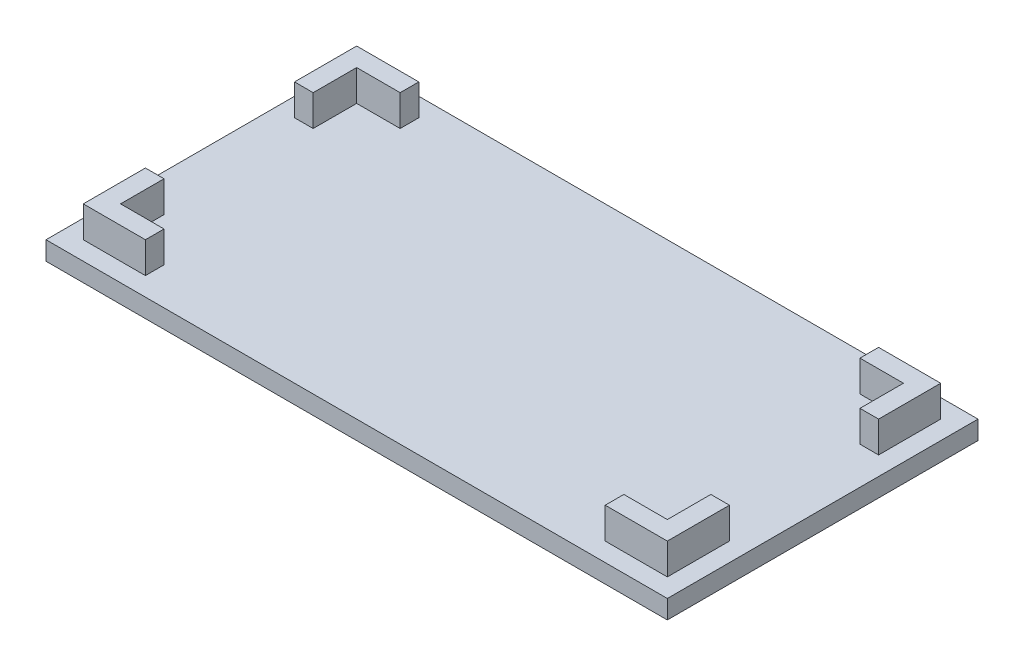
ISO-10303-21;
HEADER;
FILE_DESCRIPTION(('STEP AP214'),'2;1');
FILE_NAME('part.step','',(''),(''),'','','');
FILE_SCHEMA(('AUTOMOTIVE_DESIGN { 1 0 10303 214 1 1 1 1 }'));
ENDSEC;
DATA;
#1=APPLICATION_CONTEXT('core data for automotive mechanical design processes');
#2=APPLICATION_PROTOCOL_DEFINITION('international standard','automotive_design',2000,#1);
#3=PRODUCT_CONTEXT('',#1,'mechanical');
#4=PRODUCT('Part','Part','',(#3));
#5=PRODUCT_RELATED_PRODUCT_CATEGORY('part','',(#4));
#6=PRODUCT_DEFINITION_FORMATION('','',#4);
#7=PRODUCT_DEFINITION_CONTEXT('part definition',#1,'design');
#8=PRODUCT_DEFINITION('design','',#6,#7);
#9=PRODUCT_DEFINITION_SHAPE('','',#8);
#10=(LENGTH_UNIT() NAMED_UNIT(*) SI_UNIT(.MILLI.,.METRE.));
#11=(NAMED_UNIT(*) PLANE_ANGLE_UNIT() SI_UNIT($,.RADIAN.));
#12=(NAMED_UNIT(*) SI_UNIT($,.STERADIAN.) SOLID_ANGLE_UNIT());
#13=UNCERTAINTY_MEASURE_WITH_UNIT(LENGTH_MEASURE(1.E-05),#10,'distance_accuracy_value','');
#14=(GEOMETRIC_REPRESENTATION_CONTEXT(3) GLOBAL_UNCERTAINTY_ASSIGNED_CONTEXT((#13)) GLOBAL_UNIT_ASSIGNED_CONTEXT((#10,
#11,#12)) REPRESENTATION_CONTEXT('',''));
#15=CARTESIAN_POINT('',(0.,0.,0.));
#16=DIRECTION('',(0.,0.,1.));
#17=DIRECTION('',(1.,0.,0.));
#18=AXIS2_PLACEMENT_3D('',#15,#16,#17);
#19=CARTESIAN_POINT('',(0.,3.,0.));
#20=DIRECTION('',(0.,-1.,0.));
#21=DIRECTION('',(0.,0.,-1.));
#22=AXIS2_PLACEMENT_3D('',#19,#20,#21);
#23=PLANE('',#22);
#24=DIRECTION('',(0.,0.,1.));
#25=VECTOR('',#24,1.);
#26=CARTESIAN_POINT('',(87.,3.,-44.));
#27=LINE('',#26,#25);
#28=CARTESIAN_POINT('',(87.,3.,-47.));
#29=VERTEX_POINT('',#28);
#30=CARTESIAN_POINT('',(87.,3.,-44.));
#31=VERTEX_POINT('',#30);
#32=EDGE_CURVE('E339',#29,#31,#27,.T.);
#33=ORIENTED_EDGE('',*,*,#32,.F.);
#34=DIRECTION('',(-1.,0.,0.));
#35=VECTOR('',#34,1.);
#36=CARTESIAN_POINT('',(87.,3.,-47.));
#37=LINE('',#36,#35);
#38=CARTESIAN_POINT('',(97.,3.,-47.));
#39=VERTEX_POINT('',#38);
#40=EDGE_CURVE('E318',#39,#29,#37,.T.);
#41=ORIENTED_EDGE('',*,*,#40,.F.);
#42=DIRECTION('',(0.,0.,-1.));
#43=VECTOR('',#42,1.);
#44=CARTESIAN_POINT('',(97.,3.,-47.));
#45=LINE('',#44,#43);
#46=CARTESIAN_POINT('',(97.,3.,-37.));
#47=VERTEX_POINT('',#46);
#48=EDGE_CURVE('E322',#47,#39,#45,.T.);
#49=ORIENTED_EDGE('',*,*,#48,.F.);
#50=DIRECTION('',(1.,0.,0.));
#51=VECTOR('',#50,1.);
#52=CARTESIAN_POINT('',(97.,3.,-37.));
#53=LINE('',#52,#51);
#54=CARTESIAN_POINT('',(94.,3.,-37.));
#55=VERTEX_POINT('',#54);
#56=EDGE_CURVE('E327',#55,#47,#53,.T.);
#57=ORIENTED_EDGE('',*,*,#56,.F.);
#58=DIRECTION('',(0.,0.,1.));
#59=VECTOR('',#58,1.);
#60=CARTESIAN_POINT('',(94.,3.,-37.));
#61=LINE('',#60,#59);
#62=CARTESIAN_POINT('',(94.,3.,-44.));
#63=VERTEX_POINT('',#62);
#64=EDGE_CURVE('E331',#63,#55,#61,.T.);
#65=ORIENTED_EDGE('',*,*,#64,.F.);
#66=DIRECTION('',(1.,0.,0.));
#67=VECTOR('',#66,1.);
#68=CARTESIAN_POINT('',(94.,3.,-44.));
#69=LINE('',#68,#67);
#70=EDGE_CURVE('E335',#31,#63,#69,.T.);
#71=ORIENTED_EDGE('',*,*,#70,.F.);
#72=EDGE_LOOP('',(#33,#41,#49,#57,#65,#71));
#73=FACE_BOUND('',#72,.T.);
#74=DIRECTION('',(1.,0.,0.));
#75=VECTOR('',#74,1.);
#76=CARTESIAN_POINT('',(5.99999999999997,3.,-37.));
#77=LINE('',#76,#75);
#78=CARTESIAN_POINT('',(2.99999999999997,3.,-37.));
#79=VERTEX_POINT('',#78);
#80=CARTESIAN_POINT('',(5.99999999999997,3.,-37.));
#81=VERTEX_POINT('',#80);
#82=EDGE_CURVE('E239',#79,#81,#77,.T.);
#83=ORIENTED_EDGE('',*,*,#82,.F.);
#84=DIRECTION('',(0.,0.,1.));
#85=VECTOR('',#84,1.);
#86=CARTESIAN_POINT('',(2.99999999999997,3.,-37.));
#87=LINE('',#86,#85);
#88=CARTESIAN_POINT('',(2.99999999999997,3.,-47.));
#89=VERTEX_POINT('',#88);
#90=EDGE_CURVE('E427',#89,#79,#87,.T.);
#91=ORIENTED_EDGE('',*,*,#90,.F.);
#92=DIRECTION('',(-1.,0.,0.));
#93=VECTOR('',#92,1.);
#94=CARTESIAN_POINT('',(2.99999999999997,3.,-47.));
#95=LINE('',#94,#93);
#96=CARTESIAN_POINT('',(13.,3.,-47.));
#97=VERTEX_POINT('',#96);
#98=EDGE_CURVE('E458',#97,#89,#95,.T.);
#99=ORIENTED_EDGE('',*,*,#98,.F.);
#100=DIRECTION('',(0.,0.,-1.));
#101=VECTOR('',#100,1.);
#102=CARTESIAN_POINT('',(13.,3.,-47.));
#103=LINE('',#102,#101);
#104=CARTESIAN_POINT('',(13.,3.,-44.));
#105=VERTEX_POINT('',#104);
#106=EDGE_CURVE('E454',#105,#97,#103,.T.);
#107=ORIENTED_EDGE('',*,*,#106,.F.);
#108=DIRECTION('',(1.,0.,0.));
#109=VECTOR('',#108,1.);
#110=CARTESIAN_POINT('',(13.,3.,-44.));
#111=LINE('',#110,#109);
#112=CARTESIAN_POINT('',(5.99999999999997,3.,-44.));
#113=VERTEX_POINT('',#112);
#114=EDGE_CURVE('E450',#113,#105,#111,.T.);
#115=ORIENTED_EDGE('',*,*,#114,.F.);
#116=DIRECTION('',(0.,0.,-1.));
#117=VECTOR('',#116,1.);
#118=CARTESIAN_POINT('',(5.99999999999997,3.,-44.));
#119=LINE('',#118,#117);
#120=EDGE_CURVE('E446',#81,#113,#119,.T.);
#121=ORIENTED_EDGE('',*,*,#120,.F.);
#122=EDGE_LOOP('',(#83,#91,#99,#107,#115,#121));
#123=FACE_BOUND('',#122,.T.);
#124=DIRECTION('',(0.,0.,1.));
#125=VECTOR('',#124,1.);
#126=CARTESIAN_POINT('',(0.,3.,0.));
#127=LINE('',#126,#125);
#128=CARTESIAN_POINT('',(0.,3.,-50.));
#129=VERTEX_POINT('',#128);
#130=CARTESIAN_POINT('',(0.,3.,0.));
#131=VERTEX_POINT('',#130);
#132=EDGE_CURVE('E489',#129,#131,#127,.T.);
#133=ORIENTED_EDGE('',*,*,#132,.T.);
#134=DIRECTION('',(1.,0.,0.));
#135=VECTOR('',#134,1.);
#136=CARTESIAN_POINT('',(0.,3.,0.));
#137=LINE('',#136,#135);
#138=CARTESIAN_POINT('',(100.,3.,0.));
#139=VERTEX_POINT('',#138);
#140=EDGE_CURVE('E493',#131,#139,#137,.T.);
#141=ORIENTED_EDGE('',*,*,#140,.T.);
#142=DIRECTION('',(0.,0.,-1.));
#143=VECTOR('',#142,1.);
#144=CARTESIAN_POINT('',(100.,3.,0.));
#145=LINE('',#144,#143);
#146=CARTESIAN_POINT('',(100.,3.,-50.));
#147=VERTEX_POINT('',#146);
#148=EDGE_CURVE('E497',#139,#147,#145,.T.);
#149=ORIENTED_EDGE('',*,*,#148,.T.);
#150=DIRECTION('',(-1.,0.,0.));
#151=VECTOR('',#150,1.);
#152=CARTESIAN_POINT('',(0.,3.,-50.));
#153=LINE('',#152,#151);
#154=EDGE_CURVE('E500',#147,#129,#153,.T.);
#155=ORIENTED_EDGE('',*,*,#154,.T.);
#156=EDGE_LOOP('',(#133,#141,#149,#155));
#157=FACE_BOUND('',#156,.T.);
#158=DIRECTION('',(-1.,0.,0.));
#159=VECTOR('',#158,1.);
#160=CARTESIAN_POINT('',(94.,3.,-13.));
#161=LINE('',#160,#159);
#162=CARTESIAN_POINT('',(97.,3.,-13.));
#163=VERTEX_POINT('',#162);
#164=CARTESIAN_POINT('',(94.,3.,-13.));
#165=VERTEX_POINT('',#164);
#166=EDGE_CURVE('E228',#163,#165,#161,.T.);
#167=ORIENTED_EDGE('',*,*,#166,.F.);
#168=DIRECTION('',(0.,0.,-1.));
#169=VECTOR('',#168,1.);
#170=CARTESIAN_POINT('',(97.,3.,-13.));
#171=LINE('',#170,#169);
#172=CARTESIAN_POINT('',(97.,3.,-3.));
#173=VERTEX_POINT('',#172);
#174=EDGE_CURVE('E230',#173,#163,#171,.T.);
#175=ORIENTED_EDGE('',*,*,#174,.F.);
#176=DIRECTION('',(1.,0.,0.));
#177=VECTOR('',#176,1.);
#178=CARTESIAN_POINT('',(97.,3.,-3.));
#179=LINE('',#178,#177);
#180=CARTESIAN_POINT('',(87.,3.,-3.));
#181=VERTEX_POINT('',#180);
#182=EDGE_CURVE('E251',#181,#173,#179,.T.);
#183=ORIENTED_EDGE('',*,*,#182,.F.);
#184=DIRECTION('',(0.,0.,1.));
#185=VECTOR('',#184,1.);
#186=CARTESIAN_POINT('',(87.,3.,-3.));
#187=LINE('',#186,#185);
#188=CARTESIAN_POINT('',(87.,3.,-6.));
#189=VERTEX_POINT('',#188);
#190=EDGE_CURVE('E269',#189,#181,#187,.T.);
#191=ORIENTED_EDGE('',*,*,#190,.F.);
#192=DIRECTION('',(-1.,0.,0.));
#193=VECTOR('',#192,1.);
#194=CARTESIAN_POINT('',(87.,3.,-6.));
#195=LINE('',#194,#193);
#196=CARTESIAN_POINT('',(94.,3.,-6.));
#197=VERTEX_POINT('',#196);
#198=EDGE_CURVE('E273',#197,#189,#195,.T.);
#199=ORIENTED_EDGE('',*,*,#198,.F.);
#200=DIRECTION('',(0.,0.,1.));
#201=VECTOR('',#200,1.);
#202=CARTESIAN_POINT('',(94.,3.,-6.));
#203=LINE('',#202,#201);
#204=EDGE_CURVE('E233',#165,#197,#203,.T.);
#205=ORIENTED_EDGE('',*,*,#204,.F.);
#206=EDGE_LOOP('',(#167,#175,#183,#191,#199,#205));
#207=FACE_BOUND('',#206,.T.);
#208=DIRECTION('',(0.,0.,-1.));
#209=VECTOR('',#208,1.);
#210=CARTESIAN_POINT('',(13.,3.,-5.99999999999999));
#211=LINE('',#210,#209);
#212=CARTESIAN_POINT('',(13.,3.,-2.99999999999999));
#213=VERTEX_POINT('',#212);
#214=CARTESIAN_POINT('',(13.,3.,-5.99999999999999));
#215=VERTEX_POINT('',#214);
#216=EDGE_CURVE('E297',#213,#215,#211,.T.);
#217=ORIENTED_EDGE('',*,*,#216,.F.);
#218=DIRECTION('',(1.,0.,0.));
#219=VECTOR('',#218,1.);
#220=CARTESIAN_POINT('',(13.,3.,-2.99999999999999));
#221=LINE('',#220,#219);
#222=CARTESIAN_POINT('',(2.99999999999997,3.,-2.99999999999999));
#223=VERTEX_POINT('',#222);
#224=EDGE_CURVE('E385',#223,#213,#221,.T.);
#225=ORIENTED_EDGE('',*,*,#224,.F.);
#226=DIRECTION('',(0.,0.,1.));
#227=VECTOR('',#226,1.);
#228=CARTESIAN_POINT('',(2.99999999999997,3.,-2.99999999999999));
#229=LINE('',#228,#227);
#230=CARTESIAN_POINT('',(2.99999999999997,3.,-13.));
#231=VERTEX_POINT('',#230);
#232=EDGE_CURVE('E389',#231,#223,#229,.T.);
#233=ORIENTED_EDGE('',*,*,#232,.F.);
#234=DIRECTION('',(-1.,0.,0.));
#235=VECTOR('',#234,1.);
#236=CARTESIAN_POINT('',(2.99999999999997,3.,-13.));
#237=LINE('',#236,#235);
#238=CARTESIAN_POINT('',(5.99999999999997,3.,-13.));
#239=VERTEX_POINT('',#238);
#240=EDGE_CURVE('E394',#239,#231,#237,.T.);
#241=ORIENTED_EDGE('',*,*,#240,.F.);
#242=DIRECTION('',(0.,0.,-1.));
#243=VECTOR('',#242,1.);
#244=CARTESIAN_POINT('',(5.99999999999997,3.,-13.));
#245=LINE('',#244,#243);
#246=CARTESIAN_POINT('',(5.99999999999997,3.,-5.99999999999999));
#247=VERTEX_POINT('',#246);
#248=EDGE_CURVE('E66',#247,#239,#245,.T.);
#249=ORIENTED_EDGE('',*,*,#248,.F.);
#250=DIRECTION('',(-1.,0.,0.));
#251=VECTOR('',#250,1.);
#252=CARTESIAN_POINT('',(5.99999999999997,3.,-5.99999999999999));
#253=LINE('',#252,#251);
#254=EDGE_CURVE('E61',#215,#247,#253,.T.);
#255=ORIENTED_EDGE('',*,*,#254,.F.);
#256=EDGE_LOOP('',(#217,#225,#233,#241,#249,#255));
#257=FACE_BOUND('',#256,.T.);
#258=ADVANCED_FACE('F45',(#73,#123,#157,#207,#257),#23,.F.);
#259=CARTESIAN_POINT('',(0.,3.,0.));
#260=DIRECTION('',(1.,0.,0.));
#261=DIRECTION('',(0.,0.,-1.));
#262=AXIS2_PLACEMENT_3D('',#259,#260,#261);
#263=PLANE('',#262);
#264=DIRECTION('',(0.,0.,1.));
#265=VECTOR('',#264,1.);
#266=CARTESIAN_POINT('',(0.,0.,0.));
#267=LINE('',#266,#265);
#268=CARTESIAN_POINT('',(0.,0.,-50.));
#269=VERTEX_POINT('',#268);
#270=CARTESIAN_POINT('',(0.,0.,0.));
#271=VERTEX_POINT('',#270);
#272=EDGE_CURVE('E488',#269,#271,#267,.T.);
#273=ORIENTED_EDGE('',*,*,#272,.T.);
#274=DIRECTION('',(0.,-1.,0.));
#275=VECTOR('',#274,1.);
#276=CARTESIAN_POINT('',(0.,3.,0.));
#277=LINE('',#276,#275);
#278=EDGE_CURVE('E11',#131,#271,#277,.T.);
#279=ORIENTED_EDGE('',*,*,#278,.F.);
#280=ORIENTED_EDGE('',*,*,#132,.F.);
#281=DIRECTION('',(0.,-1.,0.));
#282=VECTOR('',#281,1.);
#283=CARTESIAN_POINT('',(0.,3.,-50.));
#284=LINE('',#283,#282);
#285=EDGE_CURVE('E503',#129,#269,#284,.T.);
#286=ORIENTED_EDGE('',*,*,#285,.T.);
#287=EDGE_LOOP('',(#273,#279,#280,#286));
#288=FACE_BOUND('',#287,.T.);
#289=ADVANCED_FACE('F47',(#288),#263,.F.);
#290=CARTESIAN_POINT('',(0.,3.,0.));
#291=DIRECTION('',(0.,0.,-1.));
#292=DIRECTION('',(-1.,0.,0.));
#293=AXIS2_PLACEMENT_3D('',#290,#291,#292);
#294=PLANE('',#293);
#295=DIRECTION('',(1.,0.,0.));
#296=VECTOR('',#295,1.);
#297=CARTESIAN_POINT('',(0.,0.,0.));
#298=LINE('',#297,#296);
#299=CARTESIAN_POINT('',(100.,0.,0.));
#300=VERTEX_POINT('',#299);
#301=EDGE_CURVE('E507',#271,#300,#298,.T.);
#302=ORIENTED_EDGE('',*,*,#301,.T.);
#303=DIRECTION('',(0.,-1.,0.));
#304=VECTOR('',#303,1.);
#305=CARTESIAN_POINT('',(100.,3.,0.));
#306=LINE('',#305,#304);
#307=EDGE_CURVE('E54',#139,#300,#306,.T.);
#308=ORIENTED_EDGE('',*,*,#307,.F.);
#309=ORIENTED_EDGE('',*,*,#140,.F.);
#310=ORIENTED_EDGE('',*,*,#278,.T.);
#311=EDGE_LOOP('',(#302,#308,#309,#310));
#312=FACE_BOUND('',#311,.T.);
#313=ADVANCED_FACE('F542',(#312),#294,.F.);
#314=CARTESIAN_POINT('',(100.,3.,0.));
#315=DIRECTION('',(-1.,0.,0.));
#316=DIRECTION('',(0.,0.,1.));
#317=AXIS2_PLACEMENT_3D('',#314,#315,#316);
#318=PLANE('',#317);
#319=DIRECTION('',(0.,0.,-1.));
#320=VECTOR('',#319,1.);
#321=CARTESIAN_POINT('',(100.,0.,0.));
#322=LINE('',#321,#320);
#323=CARTESIAN_POINT('',(100.,0.,-50.));
#324=VERTEX_POINT('',#323);
#325=EDGE_CURVE('E510',#300,#324,#322,.T.);
#326=ORIENTED_EDGE('',*,*,#325,.T.);
#327=DIRECTION('',(0.,-1.,0.));
#328=VECTOR('',#327,1.);
#329=CARTESIAN_POINT('',(100.,3.,-50.));
#330=LINE('',#329,#328);
#331=EDGE_CURVE('E518',#147,#324,#330,.T.);
#332=ORIENTED_EDGE('',*,*,#331,.F.);
#333=ORIENTED_EDGE('',*,*,#148,.F.);
#334=ORIENTED_EDGE('',*,*,#307,.T.);
#335=EDGE_LOOP('',(#326,#332,#333,#334));
#336=FACE_BOUND('',#335,.T.);
#337=ADVANCED_FACE('F527',(#336),#318,.F.);
#338=CARTESIAN_POINT('',(0.,3.,-50.));
#339=DIRECTION('',(0.,0.,1.));
#340=DIRECTION('',(1.,0.,0.));
#341=AXIS2_PLACEMENT_3D('',#338,#339,#340);
#342=PLANE('',#341);
#343=DIRECTION('',(-1.,0.,0.));
#344=VECTOR('',#343,1.);
#345=CARTESIAN_POINT('',(0.,0.,-50.));
#346=LINE('',#345,#344);
#347=EDGE_CURVE('E494',#324,#269,#346,.T.);
#348=ORIENTED_EDGE('',*,*,#347,.T.);
#349=ORIENTED_EDGE('',*,*,#285,.F.);
#350=ORIENTED_EDGE('',*,*,#154,.F.);
#351=ORIENTED_EDGE('',*,*,#331,.T.);
#352=EDGE_LOOP('',(#348,#349,#350,#351));
#353=FACE_BOUND('',#352,.T.);
#354=ADVANCED_FACE('F536',(#353),#342,.F.);
#355=CARTESIAN_POINT('',(0.,0.,0.));
#356=DIRECTION('',(0.,-1.,0.));
#357=DIRECTION('',(0.,0.,-1.));
#358=AXIS2_PLACEMENT_3D('',#355,#356,#357);
#359=PLANE('',#358);
#360=ORIENTED_EDGE('',*,*,#272,.F.);
#361=ORIENTED_EDGE('',*,*,#347,.F.);
#362=ORIENTED_EDGE('',*,*,#325,.F.);
#363=ORIENTED_EDGE('',*,*,#301,.F.);
#364=EDGE_LOOP('',(#360,#361,#362,#363));
#365=FACE_BOUND('',#364,.T.);
#366=ADVANCED_FACE('F533',(#365),#359,.T.);
#367=CARTESIAN_POINT('',(5.99999999999997,8.,-37.));
#368=DIRECTION('',(0.,0.,-1.));
#369=DIRECTION('',(-1.,0.,0.));
#370=AXIS2_PLACEMENT_3D('',#367,#368,#369);
#371=PLANE('',#370);
#372=ORIENTED_EDGE('',*,*,#82,.T.);
#373=DIRECTION('',(0.,-1.,0.));
#374=VECTOR('',#373,1.);
#375=CARTESIAN_POINT('',(5.99999999999997,8.,-37.));
#376=LINE('',#375,#374);
#377=CARTESIAN_POINT('',(5.99999999999997,8.,-37.));
#378=VERTEX_POINT('',#377);
#379=EDGE_CURVE('E484',#378,#81,#376,.T.);
#380=ORIENTED_EDGE('',*,*,#379,.F.);
#381=DIRECTION('',(1.,0.,0.));
#382=VECTOR('',#381,1.);
#383=CARTESIAN_POINT('',(5.99999999999997,8.,-37.));
#384=LINE('',#383,#382);
#385=CARTESIAN_POINT('',(2.99999999999997,8.,-37.));
#386=VERTEX_POINT('',#385);
#387=EDGE_CURVE('E422',#386,#378,#384,.T.);
#388=ORIENTED_EDGE('',*,*,#387,.F.);
#389=DIRECTION('',(0.,-1.,0.));
#390=VECTOR('',#389,1.);
#391=CARTESIAN_POINT('',(2.99999999999997,8.,-37.));
#392=LINE('',#391,#390);
#393=EDGE_CURVE('E442',#386,#79,#392,.T.);
#394=ORIENTED_EDGE('',*,*,#393,.T.);
#395=EDGE_LOOP('',(#372,#380,#388,#394));
#396=FACE_BOUND('',#395,.T.);
#397=ADVANCED_FACE('F559',(#396),#371,.F.);
#398=CARTESIAN_POINT('',(5.99999999999997,8.,-44.));
#399=DIRECTION('',(-1.,0.,0.));
#400=DIRECTION('',(0.,0.,1.));
#401=AXIS2_PLACEMENT_3D('',#398,#399,#400);
#402=PLANE('',#401);
#403=ORIENTED_EDGE('',*,*,#120,.T.);
#404=DIRECTION('',(0.,-1.,0.));
#405=VECTOR('',#404,1.);
#406=CARTESIAN_POINT('',(5.99999999999997,8.,-44.));
#407=LINE('',#406,#405);
#408=CARTESIAN_POINT('',(5.99999999999997,8.,-44.));
#409=VERTEX_POINT('',#408);
#410=EDGE_CURVE('E480',#409,#113,#407,.T.);
#411=ORIENTED_EDGE('',*,*,#410,.F.);
#412=DIRECTION('',(0.,0.,-1.));
#413=VECTOR('',#412,1.);
#414=CARTESIAN_POINT('',(5.99999999999997,8.,-44.));
#415=LINE('',#414,#413);
#416=EDGE_CURVE('E426',#378,#409,#415,.T.);
#417=ORIENTED_EDGE('',*,*,#416,.F.);
#418=ORIENTED_EDGE('',*,*,#379,.T.);
#419=EDGE_LOOP('',(#403,#411,#417,#418));
#420=FACE_BOUND('',#419,.T.);
#421=ADVANCED_FACE('F585',(#420),#402,.F.);
#422=CARTESIAN_POINT('',(13.,8.,-44.));
#423=DIRECTION('',(0.,0.,-1.));
#424=DIRECTION('',(-1.,0.,0.));
#425=AXIS2_PLACEMENT_3D('',#422,#423,#424);
#426=PLANE('',#425);
#427=ORIENTED_EDGE('',*,*,#114,.T.);
#428=DIRECTION('',(0.,-1.,0.));
#429=VECTOR('',#428,1.);
#430=CARTESIAN_POINT('',(13.,8.,-44.));
#431=LINE('',#430,#429);
#432=CARTESIAN_POINT('',(13.,8.,-44.));
#433=VERTEX_POINT('',#432);
#434=EDGE_CURVE('E476',#433,#105,#431,.T.);
#435=ORIENTED_EDGE('',*,*,#434,.F.);
#436=DIRECTION('',(1.,0.,0.));
#437=VECTOR('',#436,1.);
#438=CARTESIAN_POINT('',(13.,8.,-44.));
#439=LINE('',#438,#437);
#440=EDGE_CURVE('E430',#409,#433,#439,.T.);
#441=ORIENTED_EDGE('',*,*,#440,.F.);
#442=ORIENTED_EDGE('',*,*,#410,.T.);
#443=EDGE_LOOP('',(#427,#435,#441,#442));
#444=FACE_BOUND('',#443,.T.);
#445=ADVANCED_FACE('F594',(#444),#426,.F.);
#446=CARTESIAN_POINT('',(13.,8.,-47.));
#447=DIRECTION('',(-1.,0.,0.));
#448=DIRECTION('',(0.,0.,1.));
#449=AXIS2_PLACEMENT_3D('',#446,#447,#448);
#450=PLANE('',#449);
#451=ORIENTED_EDGE('',*,*,#106,.T.);
#452=DIRECTION('',(0.,-1.,0.));
#453=VECTOR('',#452,1.);
#454=CARTESIAN_POINT('',(13.,8.,-47.));
#455=LINE('',#454,#453);
#456=CARTESIAN_POINT('',(13.,8.,-47.));
#457=VERTEX_POINT('',#456);
#458=EDGE_CURVE('E472',#457,#97,#455,.T.);
#459=ORIENTED_EDGE('',*,*,#458,.F.);
#460=DIRECTION('',(0.,0.,-1.));
#461=VECTOR('',#460,1.);
#462=CARTESIAN_POINT('',(13.,8.,-47.));
#463=LINE('',#462,#461);
#464=EDGE_CURVE('E433',#433,#457,#463,.T.);
#465=ORIENTED_EDGE('',*,*,#464,.F.);
#466=ORIENTED_EDGE('',*,*,#434,.T.);
#467=EDGE_LOOP('',(#451,#459,#465,#466));
#468=FACE_BOUND('',#467,.T.);
#469=ADVANCED_FACE('F603',(#468),#450,.F.);
#470=CARTESIAN_POINT('',(2.99999999999997,8.,-47.));
#471=DIRECTION('',(0.,0.,1.));
#472=DIRECTION('',(1.,0.,0.));
#473=AXIS2_PLACEMENT_3D('',#470,#471,#472);
#474=PLANE('',#473);
#475=ORIENTED_EDGE('',*,*,#98,.T.);
#476=DIRECTION('',(0.,-1.,0.));
#477=VECTOR('',#476,1.);
#478=CARTESIAN_POINT('',(2.99999999999997,8.,-47.));
#479=LINE('',#478,#477);
#480=CARTESIAN_POINT('',(2.99999999999997,8.,-47.));
#481=VERTEX_POINT('',#480);
#482=EDGE_CURVE('E468',#481,#89,#479,.T.);
#483=ORIENTED_EDGE('',*,*,#482,.F.);
#484=DIRECTION('',(-1.,0.,0.));
#485=VECTOR('',#484,1.);
#486=CARTESIAN_POINT('',(2.99999999999997,8.,-47.));
#487=LINE('',#486,#485);
#488=EDGE_CURVE('E436',#457,#481,#487,.T.);
#489=ORIENTED_EDGE('',*,*,#488,.F.);
#490=ORIENTED_EDGE('',*,*,#458,.T.);
#491=EDGE_LOOP('',(#475,#483,#489,#490));
#492=FACE_BOUND('',#491,.T.);
#493=ADVANCED_FACE('F613',(#492),#474,.F.);
#494=CARTESIAN_POINT('',(2.99999999999997,8.,-37.));
#495=DIRECTION('',(1.,0.,0.));
#496=DIRECTION('',(0.,0.,-1.));
#497=AXIS2_PLACEMENT_3D('',#494,#495,#496);
#498=PLANE('',#497);
#499=ORIENTED_EDGE('',*,*,#90,.T.);
#500=ORIENTED_EDGE('',*,*,#393,.F.);
#501=DIRECTION('',(0.,0.,1.));
#502=VECTOR('',#501,1.);
#503=CARTESIAN_POINT('',(2.99999999999997,8.,-37.));
#504=LINE('',#503,#502);
#505=EDGE_CURVE('E439',#481,#386,#504,.T.);
#506=ORIENTED_EDGE('',*,*,#505,.F.);
#507=ORIENTED_EDGE('',*,*,#482,.T.);
#508=EDGE_LOOP('',(#499,#500,#506,#507));
#509=FACE_BOUND('',#508,.T.);
#510=ADVANCED_FACE('F623',(#509),#498,.F.);
#511=CARTESIAN_POINT('',(0.,8.,0.));
#512=DIRECTION('',(0.,-1.,0.));
#513=DIRECTION('',(0.,0.,-1.));
#514=AXIS2_PLACEMENT_3D('',#511,#512,#513);
#515=PLANE('',#514);
#516=ORIENTED_EDGE('',*,*,#387,.T.);
#517=ORIENTED_EDGE('',*,*,#416,.T.);
#518=ORIENTED_EDGE('',*,*,#440,.T.);
#519=ORIENTED_EDGE('',*,*,#464,.T.);
#520=ORIENTED_EDGE('',*,*,#488,.T.);
#521=ORIENTED_EDGE('',*,*,#505,.T.);
#522=EDGE_LOOP('',(#516,#517,#518,#519,#520,#521));
#523=FACE_BOUND('',#522,.T.);
#524=ADVANCED_FACE('F633',(#523),#515,.F.);
#525=CARTESIAN_POINT('',(94.,8.,-13.));
#526=DIRECTION('',(0.,0.,1.));
#527=DIRECTION('',(1.,0.,0.));
#528=AXIS2_PLACEMENT_3D('',#525,#526,#527);
#529=PLANE('',#528);
#530=ORIENTED_EDGE('',*,*,#166,.T.);
#531=DIRECTION('',(0.,-1.,0.));
#532=VECTOR('',#531,1.);
#533=CARTESIAN_POINT('',(94.,8.,-13.));
#534=LINE('',#533,#532);
#535=CARTESIAN_POINT('',(94.,8.,-13.));
#536=VERTEX_POINT('',#535);
#537=EDGE_CURVE('E343',#536,#165,#534,.T.);
#538=ORIENTED_EDGE('',*,*,#537,.F.);
#539=DIRECTION('',(-1.,0.,0.));
#540=VECTOR('',#539,1.);
#541=CARTESIAN_POINT('',(94.,8.,-13.));
#542=LINE('',#541,#540);
#543=CARTESIAN_POINT('',(97.,8.,-13.));
#544=VERTEX_POINT('',#543);
#545=EDGE_CURVE('E252',#544,#536,#542,.T.);
#546=ORIENTED_EDGE('',*,*,#545,.F.);
#547=DIRECTION('',(0.,-1.,0.));
#548=VECTOR('',#547,1.);
#549=CARTESIAN_POINT('',(97.,8.,-13.));
#550=LINE('',#549,#548);
#551=EDGE_CURVE('E246',#544,#163,#550,.T.);
#552=ORIENTED_EDGE('',*,*,#551,.T.);
#553=EDGE_LOOP('',(#530,#538,#546,#552));
#554=FACE_BOUND('',#553,.T.);
#555=ADVANCED_FACE('F254',(#554),#529,.F.);
#556=CARTESIAN_POINT('',(94.,8.,-6.));
#557=DIRECTION('',(1.,0.,0.));
#558=DIRECTION('',(0.,0.,-1.));
#559=AXIS2_PLACEMENT_3D('',#556,#557,#558);
#560=PLANE('',#559);
#561=ORIENTED_EDGE('',*,*,#204,.T.);
#562=DIRECTION('',(0.,-1.,0.));
#563=VECTOR('',#562,1.);
#564=CARTESIAN_POINT('',(94.,8.,-6.));
#565=LINE('',#564,#563);
#566=CARTESIAN_POINT('',(94.,8.,-6.));
#567=VERTEX_POINT('',#566);
#568=EDGE_CURVE('E876',#567,#197,#565,.T.);
#569=ORIENTED_EDGE('',*,*,#568,.F.);
#570=DIRECTION('',(0.,0.,1.));
#571=VECTOR('',#570,1.);
#572=CARTESIAN_POINT('',(94.,8.,-6.));
#573=LINE('',#572,#571);
#574=EDGE_CURVE('E287',#536,#567,#573,.T.);
#575=ORIENTED_EDGE('',*,*,#574,.F.);
#576=ORIENTED_EDGE('',*,*,#537,.T.);
#577=EDGE_LOOP('',(#561,#569,#575,#576));
#578=FACE_BOUND('',#577,.T.);
#579=ADVANCED_FACE('F652',(#578),#560,.F.);
#580=CARTESIAN_POINT('',(87.,8.,-6.));
#581=DIRECTION('',(0.,0.,1.));
#582=DIRECTION('',(1.,0.,0.));
#583=AXIS2_PLACEMENT_3D('',#580,#581,#582);
#584=PLANE('',#583);
#585=ORIENTED_EDGE('',*,*,#198,.T.);
#586=DIRECTION('',(0.,-1.,0.));
#587=VECTOR('',#586,1.);
#588=CARTESIAN_POINT('',(87.,8.,-6.));
#589=LINE('',#588,#587);
#590=CARTESIAN_POINT('',(87.,8.,-6.));
#591=VERTEX_POINT('',#590);
#592=EDGE_CURVE('E880',#591,#189,#589,.T.);
#593=ORIENTED_EDGE('',*,*,#592,.F.);
#594=DIRECTION('',(-1.,0.,0.));
#595=VECTOR('',#594,1.);
#596=CARTESIAN_POINT('',(87.,8.,-6.));
#597=LINE('',#596,#595);
#598=EDGE_CURVE('E284',#567,#591,#597,.T.);
#599=ORIENTED_EDGE('',*,*,#598,.F.);
#600=ORIENTED_EDGE('',*,*,#568,.T.);
#601=EDGE_LOOP('',(#585,#593,#599,#600));
#602=FACE_BOUND('',#601,.T.);
#603=ADVANCED_FACE('F661',(#602),#584,.F.);
#604=CARTESIAN_POINT('',(87.,8.,-3.));
#605=DIRECTION('',(1.,0.,0.));
#606=DIRECTION('',(0.,0.,-1.));
#607=AXIS2_PLACEMENT_3D('',#604,#605,#606);
#608=PLANE('',#607);
#609=ORIENTED_EDGE('',*,*,#190,.T.);
#610=DIRECTION('',(0.,-1.,0.));
#611=VECTOR('',#610,1.);
#612=CARTESIAN_POINT('',(87.,8.,-3.));
#613=LINE('',#612,#611);
#614=CARTESIAN_POINT('',(87.,8.,-3.));
#615=VERTEX_POINT('',#614);
#616=EDGE_CURVE('E263',#615,#181,#613,.T.);
#617=ORIENTED_EDGE('',*,*,#616,.F.);
#618=DIRECTION('',(0.,0.,1.));
#619=VECTOR('',#618,1.);
#620=CARTESIAN_POINT('',(87.,8.,-3.));
#621=LINE('',#620,#619);
#622=EDGE_CURVE('E281',#591,#615,#621,.T.);
#623=ORIENTED_EDGE('',*,*,#622,.F.);
#624=ORIENTED_EDGE('',*,*,#592,.T.);
#625=EDGE_LOOP('',(#609,#617,#623,#624));
#626=FACE_BOUND('',#625,.T.);
#627=ADVANCED_FACE('F671',(#626),#608,.F.);
#628=CARTESIAN_POINT('',(97.,8.,-3.));
#629=DIRECTION('',(0.,0.,-1.));
#630=DIRECTION('',(-1.,0.,0.));
#631=AXIS2_PLACEMENT_3D('',#628,#629,#630);
#632=PLANE('',#631);
#633=ORIENTED_EDGE('',*,*,#182,.T.);
#634=DIRECTION('',(0.,-1.,0.));
#635=VECTOR('',#634,1.);
#636=CARTESIAN_POINT('',(97.,8.,-3.));
#637=LINE('',#636,#635);
#638=CARTESIAN_POINT('',(97.,8.,-3.));
#639=VERTEX_POINT('',#638);
#640=EDGE_CURVE('E249',#639,#173,#637,.T.);
#641=ORIENTED_EDGE('',*,*,#640,.F.);
#642=DIRECTION('',(1.,0.,0.));
#643=VECTOR('',#642,1.);
#644=CARTESIAN_POINT('',(97.,8.,-3.));
#645=LINE('',#644,#643);
#646=EDGE_CURVE('E261',#615,#639,#645,.T.);
#647=ORIENTED_EDGE('',*,*,#646,.F.);
#648=ORIENTED_EDGE('',*,*,#616,.T.);
#649=EDGE_LOOP('',(#633,#641,#647,#648));
#650=FACE_BOUND('',#649,.T.);
#651=ADVANCED_FACE('F681',(#650),#632,.F.);
#652=CARTESIAN_POINT('',(97.,8.,-13.));
#653=DIRECTION('',(-1.,0.,0.));
#654=DIRECTION('',(0.,0.,1.));
#655=AXIS2_PLACEMENT_3D('',#652,#653,#654);
#656=PLANE('',#655);
#657=ORIENTED_EDGE('',*,*,#174,.T.);
#658=ORIENTED_EDGE('',*,*,#551,.F.);
#659=DIRECTION('',(0.,0.,-1.));
#660=VECTOR('',#659,1.);
#661=CARTESIAN_POINT('',(97.,8.,-13.));
#662=LINE('',#661,#660);
#663=EDGE_CURVE('E257',#639,#544,#662,.T.);
#664=ORIENTED_EDGE('',*,*,#663,.F.);
#665=ORIENTED_EDGE('',*,*,#640,.T.);
#666=EDGE_LOOP('',(#657,#658,#664,#665));
#667=FACE_BOUND('',#666,.T.);
#668=ADVANCED_FACE('F244',(#667),#656,.F.);
#669=CARTESIAN_POINT('',(0.,8.,0.));
#670=DIRECTION('',(0.,-1.,0.));
#671=DIRECTION('',(0.,0.,-1.));
#672=AXIS2_PLACEMENT_3D('',#669,#670,#671);
#673=PLANE('',#672);
#674=ORIENTED_EDGE('',*,*,#545,.T.);
#675=ORIENTED_EDGE('',*,*,#574,.T.);
#676=ORIENTED_EDGE('',*,*,#598,.T.);
#677=ORIENTED_EDGE('',*,*,#622,.T.);
#678=ORIENTED_EDGE('',*,*,#646,.T.);
#679=ORIENTED_EDGE('',*,*,#663,.T.);
#680=EDGE_LOOP('',(#674,#675,#676,#677,#678,#679));
#681=FACE_BOUND('',#680,.T.);
#682=ADVANCED_FACE('F700',(#681),#673,.F.);
#683=CARTESIAN_POINT('',(87.,8.,-44.));
#684=DIRECTION('',(1.,0.,0.));
#685=DIRECTION('',(0.,0.,-1.));
#686=AXIS2_PLACEMENT_3D('',#683,#684,#685);
#687=PLANE('',#686);
#688=ORIENTED_EDGE('',*,*,#32,.T.);
#689=DIRECTION('',(0.,-1.,0.));
#690=VECTOR('',#689,1.);
#691=CARTESIAN_POINT('',(87.,8.,-44.));
#692=LINE('',#691,#690);
#693=CARTESIAN_POINT('',(87.,8.,-44.));
#694=VERTEX_POINT('',#693);
#695=EDGE_CURVE('E292',#694,#31,#692,.T.);
#696=ORIENTED_EDGE('',*,*,#695,.F.);
#697=DIRECTION('',(0.,0.,1.));
#698=VECTOR('',#697,1.);
#699=CARTESIAN_POINT('',(87.,8.,-44.));
#700=LINE('',#699,#698);
#701=CARTESIAN_POINT('',(87.,8.,-47.));
#702=VERTEX_POINT('',#701);
#703=EDGE_CURVE('E323',#702,#694,#700,.T.);
#704=ORIENTED_EDGE('',*,*,#703,.F.);
#705=DIRECTION('',(0.,-1.,0.));
#706=VECTOR('',#705,1.);
#707=CARTESIAN_POINT('',(87.,8.,-47.));
#708=LINE('',#707,#706);
#709=EDGE_CURVE('E313',#702,#29,#708,.T.);
#710=ORIENTED_EDGE('',*,*,#709,.T.);
#711=EDGE_LOOP('',(#688,#696,#704,#710));
#712=FACE_BOUND('',#711,.T.);
#713=ADVANCED_FACE('F709',(#712),#687,.F.);
#714=CARTESIAN_POINT('',(94.,8.,-44.));
#715=DIRECTION('',(0.,0.,-1.));
#716=DIRECTION('',(-1.,0.,0.));
#717=AXIS2_PLACEMENT_3D('',#714,#715,#716);
#718=PLANE('',#717);
#719=ORIENTED_EDGE('',*,*,#70,.T.);
#720=DIRECTION('',(0.,-1.,0.));
#721=VECTOR('',#720,1.);
#722=CARTESIAN_POINT('',(94.,8.,-44.));
#723=LINE('',#722,#721);
#724=CARTESIAN_POINT('',(94.,8.,-44.));
#725=VERTEX_POINT('',#724);
#726=EDGE_CURVE('E296',#725,#63,#723,.T.);
#727=ORIENTED_EDGE('',*,*,#726,.F.);
#728=DIRECTION('',(1.,0.,0.));
#729=VECTOR('',#728,1.);
#730=CARTESIAN_POINT('',(94.,8.,-44.));
#731=LINE('',#730,#729);
#732=EDGE_CURVE('E355',#694,#725,#731,.T.);
#733=ORIENTED_EDGE('',*,*,#732,.F.);
#734=ORIENTED_EDGE('',*,*,#695,.T.);
#735=EDGE_LOOP('',(#719,#727,#733,#734));
#736=FACE_BOUND('',#735,.T.);
#737=ADVANCED_FACE('F719',(#736),#718,.F.);
#738=CARTESIAN_POINT('',(94.,8.,-37.));
#739=DIRECTION('',(1.,0.,0.));
#740=DIRECTION('',(0.,0.,-1.));
#741=AXIS2_PLACEMENT_3D('',#738,#739,#740);
#742=PLANE('',#741);
#743=ORIENTED_EDGE('',*,*,#64,.T.);
#744=DIRECTION('',(0.,-1.,0.));
#745=VECTOR('',#744,1.);
#746=CARTESIAN_POINT('',(94.,8.,-37.));
#747=LINE('',#746,#745);
#748=CARTESIAN_POINT('',(94.,8.,-37.));
#749=VERTEX_POINT('',#748);
#750=EDGE_CURVE('E301',#749,#55,#747,.T.);
#751=ORIENTED_EDGE('',*,*,#750,.F.);
#752=DIRECTION('',(0.,0.,1.));
#753=VECTOR('',#752,1.);
#754=CARTESIAN_POINT('',(94.,8.,-37.));
#755=LINE('',#754,#753);
#756=EDGE_CURVE('E352',#725,#749,#755,.T.);
#757=ORIENTED_EDGE('',*,*,#756,.F.);
#758=ORIENTED_EDGE('',*,*,#726,.T.);
#759=EDGE_LOOP('',(#743,#751,#757,#758));
#760=FACE_BOUND('',#759,.T.);
#761=ADVANCED_FACE('F729',(#760),#742,.F.);
#762=CARTESIAN_POINT('',(97.,8.,-37.));
#763=DIRECTION('',(0.,0.,-1.));
#764=DIRECTION('',(-1.,0.,0.));
#765=AXIS2_PLACEMENT_3D('',#762,#763,#764);
#766=PLANE('',#765);
#767=ORIENTED_EDGE('',*,*,#56,.T.);
#768=DIRECTION('',(0.,-1.,0.));
#769=VECTOR('',#768,1.);
#770=CARTESIAN_POINT('',(97.,8.,-37.));
#771=LINE('',#770,#769);
#772=CARTESIAN_POINT('',(97.,8.,-37.));
#773=VERTEX_POINT('',#772);
#774=EDGE_CURVE('E305',#773,#47,#771,.T.);
#775=ORIENTED_EDGE('',*,*,#774,.F.);
#776=DIRECTION('',(1.,0.,0.));
#777=VECTOR('',#776,1.);
#778=CARTESIAN_POINT('',(97.,8.,-37.));
#779=LINE('',#778,#777);
#780=EDGE_CURVE('E349',#749,#773,#779,.T.);
#781=ORIENTED_EDGE('',*,*,#780,.F.);
#782=ORIENTED_EDGE('',*,*,#750,.T.);
#783=EDGE_LOOP('',(#767,#775,#781,#782));
#784=FACE_BOUND('',#783,.T.);
#785=ADVANCED_FACE('F739',(#784),#766,.F.);
#786=CARTESIAN_POINT('',(97.,8.,-47.));
#787=DIRECTION('',(-1.,0.,0.));
#788=DIRECTION('',(0.,0.,1.));
#789=AXIS2_PLACEMENT_3D('',#786,#787,#788);
#790=PLANE('',#789);
#791=ORIENTED_EDGE('',*,*,#48,.T.);
#792=DIRECTION('',(0.,-1.,0.));
#793=VECTOR('',#792,1.);
#794=CARTESIAN_POINT('',(97.,8.,-47.));
#795=LINE('',#794,#793);
#796=CARTESIAN_POINT('',(97.,8.,-47.));
#797=VERTEX_POINT('',#796);
#798=EDGE_CURVE('E309',#797,#39,#795,.T.);
#799=ORIENTED_EDGE('',*,*,#798,.F.);
#800=DIRECTION('',(0.,0.,-1.));
#801=VECTOR('',#800,1.);
#802=CARTESIAN_POINT('',(97.,8.,-47.));
#803=LINE('',#802,#801);
#804=EDGE_CURVE('E346',#773,#797,#803,.T.);
#805=ORIENTED_EDGE('',*,*,#804,.F.);
#806=ORIENTED_EDGE('',*,*,#774,.T.);
#807=EDGE_LOOP('',(#791,#799,#805,#806));
#808=FACE_BOUND('',#807,.T.);
#809=ADVANCED_FACE('F749',(#808),#790,.F.);
#810=CARTESIAN_POINT('',(87.,8.,-47.));
#811=DIRECTION('',(0.,0.,1.));
#812=DIRECTION('',(1.,0.,0.));
#813=AXIS2_PLACEMENT_3D('',#810,#811,#812);
#814=PLANE('',#813);
#815=ORIENTED_EDGE('',*,*,#40,.T.);
#816=ORIENTED_EDGE('',*,*,#709,.F.);
#817=DIRECTION('',(-1.,0.,0.));
#818=VECTOR('',#817,1.);
#819=CARTESIAN_POINT('',(87.,8.,-47.));
#820=LINE('',#819,#818);
#821=EDGE_CURVE('E317',#797,#702,#820,.T.);
#822=ORIENTED_EDGE('',*,*,#821,.F.);
#823=ORIENTED_EDGE('',*,*,#798,.T.);
#824=EDGE_LOOP('',(#815,#816,#822,#823));
#825=FACE_BOUND('',#824,.T.);
#826=ADVANCED_FACE('F759',(#825),#814,.F.);
#827=CARTESIAN_POINT('',(0.,8.,0.));
#828=DIRECTION('',(0.,-1.,0.));
#829=DIRECTION('',(0.,0.,-1.));
#830=AXIS2_PLACEMENT_3D('',#827,#828,#829);
#831=PLANE('',#830);
#832=ORIENTED_EDGE('',*,*,#703,.T.);
#833=ORIENTED_EDGE('',*,*,#732,.T.);
#834=ORIENTED_EDGE('',*,*,#756,.T.);
#835=ORIENTED_EDGE('',*,*,#780,.T.);
#836=ORIENTED_EDGE('',*,*,#804,.T.);
#837=ORIENTED_EDGE('',*,*,#821,.T.);
#838=EDGE_LOOP('',(#832,#833,#834,#835,#836,#837));
#839=FACE_BOUND('',#838,.T.);
#840=ADVANCED_FACE('F769',(#839),#831,.F.);
#841=CARTESIAN_POINT('',(13.,8.,-5.99999999999999));
#842=DIRECTION('',(-1.,0.,0.));
#843=DIRECTION('',(0.,0.,1.));
#844=AXIS2_PLACEMENT_3D('',#841,#842,#843);
#845=PLANE('',#844);
#846=ORIENTED_EDGE('',*,*,#216,.T.);
#847=DIRECTION('',(0.,-1.,0.));
#848=VECTOR('',#847,1.);
#849=CARTESIAN_POINT('',(13.,8.,-5.99999999999999));
#850=LINE('',#849,#848);
#851=CARTESIAN_POINT('',(13.,8.,-5.99999999999999));
#852=VERTEX_POINT('',#851);
#853=EDGE_CURVE('E361',#852,#215,#850,.T.);
#854=ORIENTED_EDGE('',*,*,#853,.F.);
#855=DIRECTION('',(0.,0.,-1.));
#856=VECTOR('',#855,1.);
#857=CARTESIAN_POINT('',(13.,8.,-5.99999999999999));
#858=LINE('',#857,#856);
#859=CARTESIAN_POINT('',(13.,8.,-2.99999999999999));
#860=VERTEX_POINT('',#859);
#861=EDGE_CURVE('E390',#860,#852,#858,.T.);
#862=ORIENTED_EDGE('',*,*,#861,.F.);
#863=DIRECTION('',(0.,-1.,0.));
#864=VECTOR('',#863,1.);
#865=CARTESIAN_POINT('',(13.,8.,-2.99999999999999));
#866=LINE('',#865,#864);
#867=EDGE_CURVE('E380',#860,#213,#866,.T.);
#868=ORIENTED_EDGE('',*,*,#867,.T.);
#869=EDGE_LOOP('',(#846,#854,#862,#868));
#870=FACE_BOUND('',#869,.T.);
#871=ADVANCED_FACE('F779',(#870),#845,.F.);
#872=CARTESIAN_POINT('',(5.99999999999997,8.,-5.99999999999999));
#873=DIRECTION('',(0.,0.,1.));
#874=DIRECTION('',(1.,0.,0.));
#875=AXIS2_PLACEMENT_3D('',#872,#873,#874);
#876=PLANE('',#875);
#877=ORIENTED_EDGE('',*,*,#254,.T.);
#878=DIRECTION('',(0.,-1.,0.));
#879=VECTOR('',#878,1.);
#880=CARTESIAN_POINT('',(5.99999999999997,8.,-5.99999999999999));
#881=LINE('',#880,#879);
#882=CARTESIAN_POINT('',(5.99999999999997,8.,-5.99999999999999));
#883=VERTEX_POINT('',#882);
#884=EDGE_CURVE('E364',#883,#247,#881,.T.);
#885=ORIENTED_EDGE('',*,*,#884,.F.);
#886=DIRECTION('',(-1.,0.,0.));
#887=VECTOR('',#886,1.);
#888=CARTESIAN_POINT('',(5.99999999999997,8.,-5.99999999999999));
#889=LINE('',#888,#887);
#890=EDGE_CURVE('E416',#852,#883,#889,.T.);
#891=ORIENTED_EDGE('',*,*,#890,.F.);
#892=ORIENTED_EDGE('',*,*,#853,.T.);
#893=EDGE_LOOP('',(#877,#885,#891,#892));
#894=FACE_BOUND('',#893,.T.);
#895=ADVANCED_FACE('F789',(#894),#876,.F.);
#896=CARTESIAN_POINT('',(5.99999999999997,8.,-13.));
#897=DIRECTION('',(-1.,0.,0.));
#898=DIRECTION('',(0.,0.,1.));
#899=AXIS2_PLACEMENT_3D('',#896,#897,#898);
#900=PLANE('',#899);
#901=ORIENTED_EDGE('',*,*,#248,.T.);
#902=DIRECTION('',(0.,-1.,0.));
#903=VECTOR('',#902,1.);
#904=CARTESIAN_POINT('',(5.99999999999997,8.,-13.));
#905=LINE('',#904,#903);
#906=CARTESIAN_POINT('',(5.99999999999997,8.,-13.));
#907=VERTEX_POINT('',#906);
#908=EDGE_CURVE('E368',#907,#239,#905,.T.);
#909=ORIENTED_EDGE('',*,*,#908,.F.);
#910=DIRECTION('',(0.,0.,-1.));
#911=VECTOR('',#910,1.);
#912=CARTESIAN_POINT('',(5.99999999999997,8.,-13.));
#913=LINE('',#912,#911);
#914=EDGE_CURVE('E413',#883,#907,#913,.T.);
#915=ORIENTED_EDGE('',*,*,#914,.F.);
#916=ORIENTED_EDGE('',*,*,#884,.T.);
#917=EDGE_LOOP('',(#901,#909,#915,#916));
#918=FACE_BOUND('',#917,.T.);
#919=ADVANCED_FACE('F799',(#918),#900,.F.);
#920=CARTESIAN_POINT('',(2.99999999999997,8.,-13.));
#921=DIRECTION('',(0.,0.,1.));
#922=DIRECTION('',(1.,0.,0.));
#923=AXIS2_PLACEMENT_3D('',#920,#921,#922);
#924=PLANE('',#923);
#925=ORIENTED_EDGE('',*,*,#240,.T.);
#926=DIRECTION('',(0.,-1.,0.));
#927=VECTOR('',#926,1.);
#928=CARTESIAN_POINT('',(2.99999999999997,8.,-13.));
#929=LINE('',#928,#927);
#930=CARTESIAN_POINT('',(2.99999999999997,8.,-13.));
#931=VERTEX_POINT('',#930);
#932=EDGE_CURVE('E372',#931,#231,#929,.T.);
#933=ORIENTED_EDGE('',*,*,#932,.F.);
#934=DIRECTION('',(-1.,0.,0.));
#935=VECTOR('',#934,1.);
#936=CARTESIAN_POINT('',(2.99999999999997,8.,-13.));
#937=LINE('',#936,#935);
#938=EDGE_CURVE('E410',#907,#931,#937,.T.);
#939=ORIENTED_EDGE('',*,*,#938,.F.);
#940=ORIENTED_EDGE('',*,*,#908,.T.);
#941=EDGE_LOOP('',(#925,#933,#939,#940));
#942=FACE_BOUND('',#941,.T.);
#943=ADVANCED_FACE('F809',(#942),#924,.F.);
#944=CARTESIAN_POINT('',(2.99999999999997,8.,-2.99999999999999));
#945=DIRECTION('',(1.,0.,0.));
#946=DIRECTION('',(0.,0.,-1.));
#947=AXIS2_PLACEMENT_3D('',#944,#945,#946);
#948=PLANE('',#947);
#949=ORIENTED_EDGE('',*,*,#232,.T.);
#950=DIRECTION('',(0.,-1.,0.));
#951=VECTOR('',#950,1.);
#952=CARTESIAN_POINT('',(2.99999999999997,8.,-2.99999999999999));
#953=LINE('',#952,#951);
#954=CARTESIAN_POINT('',(2.99999999999997,8.,-2.99999999999999));
#955=VERTEX_POINT('',#954);
#956=EDGE_CURVE('E376',#955,#223,#953,.T.);
#957=ORIENTED_EDGE('',*,*,#956,.F.);
#958=DIRECTION('',(0.,0.,1.));
#959=VECTOR('',#958,1.);
#960=CARTESIAN_POINT('',(2.99999999999997,8.,-2.99999999999999));
#961=LINE('',#960,#959);
#962=EDGE_CURVE('E407',#931,#955,#961,.T.);
#963=ORIENTED_EDGE('',*,*,#962,.F.);
#964=ORIENTED_EDGE('',*,*,#932,.T.);
#965=EDGE_LOOP('',(#949,#957,#963,#964));
#966=FACE_BOUND('',#965,.T.);
#967=ADVANCED_FACE('F819',(#966),#948,.F.);
#968=CARTESIAN_POINT('',(13.,8.,-2.99999999999999));
#969=DIRECTION('',(0.,0.,-1.));
#970=DIRECTION('',(-1.,0.,0.));
#971=AXIS2_PLACEMENT_3D('',#968,#969,#970);
#972=PLANE('',#971);
#973=ORIENTED_EDGE('',*,*,#224,.T.);
#974=ORIENTED_EDGE('',*,*,#867,.F.);
#975=DIRECTION('',(1.,0.,0.));
#976=VECTOR('',#975,1.);
#977=CARTESIAN_POINT('',(13.,8.,-2.99999999999999));
#978=LINE('',#977,#976);
#979=EDGE_CURVE('E384',#955,#860,#978,.T.);
#980=ORIENTED_EDGE('',*,*,#979,.F.);
#981=ORIENTED_EDGE('',*,*,#956,.T.);
#982=EDGE_LOOP('',(#973,#974,#980,#981));
#983=FACE_BOUND('',#982,.T.);
#984=ADVANCED_FACE('F829',(#983),#972,.F.);
#985=CARTESIAN_POINT('',(0.,8.,0.));
#986=DIRECTION('',(0.,-1.,0.));
#987=DIRECTION('',(0.,0.,-1.));
#988=AXIS2_PLACEMENT_3D('',#985,#986,#987);
#989=PLANE('',#988);
#990=ORIENTED_EDGE('',*,*,#861,.T.);
#991=ORIENTED_EDGE('',*,*,#890,.T.);
#992=ORIENTED_EDGE('',*,*,#914,.T.);
#993=ORIENTED_EDGE('',*,*,#938,.T.);
#994=ORIENTED_EDGE('',*,*,#962,.T.);
#995=ORIENTED_EDGE('',*,*,#979,.T.);
#996=EDGE_LOOP('',(#990,#991,#992,#993,#994,#995));
#997=FACE_BOUND('',#996,.T.);
#998=ADVANCED_FACE('F839',(#997),#989,.F.);
#999=CLOSED_SHELL('',(#258,#289,#313,#337,#354,#366,#397,#421,#445,#469,#493,#510,#524,#555,
#579,#603,#627,#651,#668,#682,#713,#737,#761,#785,#809,#826,#840,#871,#895,#919,#943,#967,#984,#998));
#1000=MANIFOLD_SOLID_BREP('B2',#999);
#1001=ADVANCED_BREP_SHAPE_REPRESENTATION('',(#18,#1000),#14);
#1002=SHAPE_DEFINITION_REPRESENTATION(#9,#1001);
ENDSEC;
END-ISO-10303-21;
